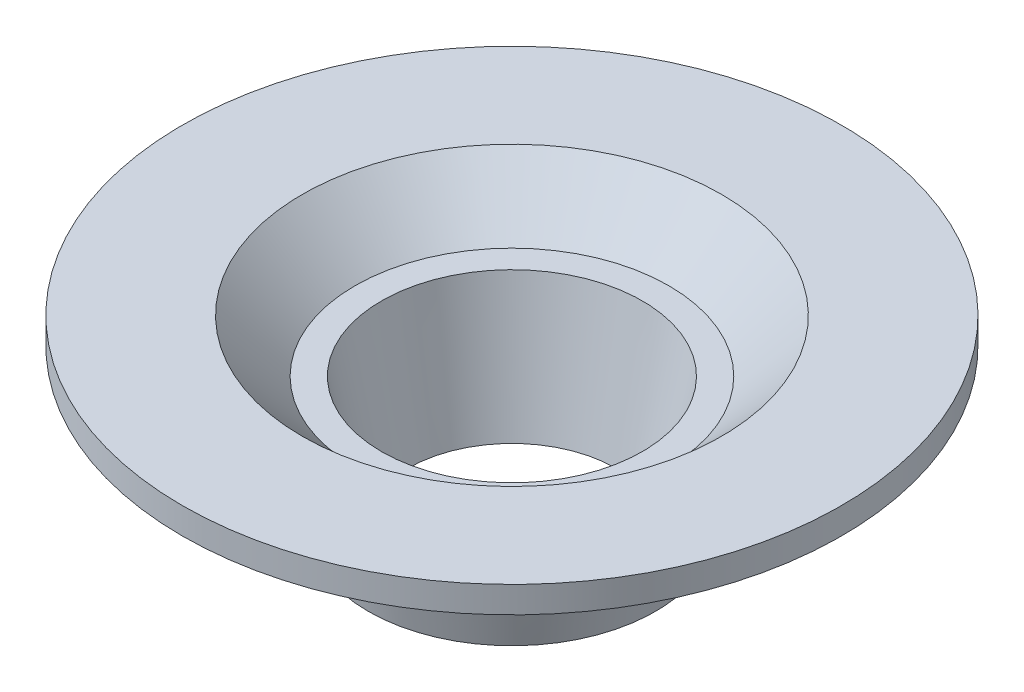
ISO-10303-21;
HEADER;
FILE_DESCRIPTION(('STEP AP214'),'2;1');
FILE_NAME('part.step','',(''),(''),'','','');
FILE_SCHEMA(('AUTOMOTIVE_DESIGN { 1 0 10303 214 1 1 1 1 }'));
ENDSEC;
DATA;
#1=APPLICATION_CONTEXT('core data for automotive mechanical design processes');
#2=APPLICATION_PROTOCOL_DEFINITION('international standard','automotive_design',2000,#1);
#3=PRODUCT_CONTEXT('',#1,'mechanical');
#4=PRODUCT('Part','Part','',(#3));
#5=PRODUCT_RELATED_PRODUCT_CATEGORY('part','',(#4));
#6=PRODUCT_DEFINITION_FORMATION('','',#4);
#7=PRODUCT_DEFINITION_CONTEXT('part definition',#1,'design');
#8=PRODUCT_DEFINITION('design','',#6,#7);
#9=PRODUCT_DEFINITION_SHAPE('','',#8);
#10=(LENGTH_UNIT() NAMED_UNIT(*) SI_UNIT(.MILLI.,.METRE.));
#11=(NAMED_UNIT(*) PLANE_ANGLE_UNIT() SI_UNIT($,.RADIAN.));
#12=(NAMED_UNIT(*) SI_UNIT($,.STERADIAN.) SOLID_ANGLE_UNIT());
#13=UNCERTAINTY_MEASURE_WITH_UNIT(LENGTH_MEASURE(1.E-05),#10,'distance_accuracy_value','');
#14=(GEOMETRIC_REPRESENTATION_CONTEXT(3) GLOBAL_UNCERTAINTY_ASSIGNED_CONTEXT((#13)) GLOBAL_UNIT_ASSIGNED_CONTEXT((#10,
#11,#12)) REPRESENTATION_CONTEXT('',''));
#15=CARTESIAN_POINT('',(0.,0.,0.));
#16=DIRECTION('',(0.,0.,1.));
#17=DIRECTION('',(1.,0.,0.));
#18=AXIS2_PLACEMENT_3D('',#15,#16,#17);
#19=CARTESIAN_POINT('',(0.,0.,0.));
#20=DIRECTION('',(0.,1.,0.));
#21=DIRECTION('',(0.,0.,1.));
#22=AXIS2_PLACEMENT_3D('',#19,#20,#21);
#23=CONICAL_SURFACE('',#22,4.95,0.197395559849881);
#24=CARTESIAN_POINT('',(0.,-5.,0.));
#25=DIRECTION('',(0.,1.,0.));
#26=DIRECTION('',(0.,0.,1.));
#27=AXIS2_PLACEMENT_3D('',#24,#25,#26);
#28=CIRCLE('',#27,3.95);
#29=CARTESIAN_POINT('',(0.,-5.,3.95));
#30=VERTEX_POINT('',#29);
#31=EDGE_CURVE('E71',#30,#30,#28,.T.);
#32=ORIENTED_EDGE('',*,*,#31,.F.);
#33=EDGE_LOOP('',(#32));
#34=FACE_BOUND('',#33,.T.);
#35=CARTESIAN_POINT('',(0.,0.,0.));
#36=DIRECTION('',(0.,1.,0.));
#37=DIRECTION('',(0.,0.,1.));
#38=AXIS2_PLACEMENT_3D('',#35,#36,#37);
#39=CIRCLE('',#38,4.95);
#40=CARTESIAN_POINT('',(0.,0.,4.95));
#41=VERTEX_POINT('',#40);
#42=EDGE_CURVE('E10',#41,#41,#39,.T.);
#43=ORIENTED_EDGE('',*,*,#42,.T.);
#44=EDGE_LOOP('',(#43));
#45=FACE_BOUND('',#44,.T.);
#46=ADVANCED_FACE('F37',(#34,#45),#23,.F.);
#47=CARTESIAN_POINT('',(4.95,0.,0.));
#48=DIRECTION('',(0.,-1.,0.));
#49=DIRECTION('',(0.,0.,-1.));
#50=AXIS2_PLACEMENT_3D('',#47,#48,#49);
#51=PLANE('',#50);
#52=ORIENTED_EDGE('',*,*,#42,.F.);
#53=EDGE_LOOP('',(#52));
#54=FACE_BOUND('',#53,.T.);
#55=CARTESIAN_POINT('',(0.,0.,0.));
#56=DIRECTION('',(0.,1.,0.));
#57=DIRECTION('',(0.,0.,1.));
#58=AXIS2_PLACEMENT_3D('',#55,#56,#57);
#59=CIRCLE('',#58,5.95);
#60=CARTESIAN_POINT('',(0.,0.,5.95));
#61=VERTEX_POINT('',#60);
#62=EDGE_CURVE('E43',#61,#61,#59,.T.);
#63=ORIENTED_EDGE('',*,*,#62,.T.);
#64=EDGE_LOOP('',(#63));
#65=FACE_BOUND('',#64,.T.);
#66=ADVANCED_FACE('F78',(#54,#65),#51,.F.);
#67=CARTESIAN_POINT('',(0.,2.,0.));
#68=DIRECTION('',(0.,1.,0.));
#69=DIRECTION('',(0.,0.,1.));
#70=AXIS2_PLACEMENT_3D('',#67,#68,#69);
#71=CONICAL_SURFACE('',#70,7.95,0.785398163397448);
#72=ORIENTED_EDGE('',*,*,#62,.F.);
#73=EDGE_LOOP('',(#72));
#74=FACE_BOUND('',#73,.T.);
#75=CARTESIAN_POINT('',(0.,2.,0.));
#76=DIRECTION('',(0.,1.,0.));
#77=DIRECTION('',(0.,0.,1.));
#78=AXIS2_PLACEMENT_3D('',#75,#76,#77);
#79=CIRCLE('',#78,7.95);
#80=CARTESIAN_POINT('',(0.,2.,7.95));
#81=VERTEX_POINT('',#80);
#82=EDGE_CURVE('E47',#81,#81,#79,.T.);
#83=ORIENTED_EDGE('',*,*,#82,.T.);
#84=EDGE_LOOP('',(#83));
#85=FACE_BOUND('',#84,.T.);
#86=ADVANCED_FACE('F82',(#74,#85),#71,.F.);
#87=CARTESIAN_POINT('',(7.95,2.,0.));
#88=DIRECTION('',(0.,-1.,0.));
#89=DIRECTION('',(0.,0.,-1.));
#90=AXIS2_PLACEMENT_3D('',#87,#88,#89);
#91=PLANE('',#90);
#92=ORIENTED_EDGE('',*,*,#82,.F.);
#93=EDGE_LOOP('',(#92));
#94=FACE_BOUND('',#93,.T.);
#95=CARTESIAN_POINT('',(0.,2.,0.));
#96=DIRECTION('',(0.,1.,0.));
#97=DIRECTION('',(0.,0.,1.));
#98=AXIS2_PLACEMENT_3D('',#95,#96,#97);
#99=CIRCLE('',#98,12.5);
#100=CARTESIAN_POINT('',(0.,2.,12.5));
#101=VERTEX_POINT('',#100);
#102=EDGE_CURVE('E51',#101,#101,#99,.T.);
#103=ORIENTED_EDGE('',*,*,#102,.T.);
#104=EDGE_LOOP('',(#103));
#105=FACE_BOUND('',#104,.T.);
#106=ADVANCED_FACE('F87',(#94,#105),#91,.F.);
#107=CARTESIAN_POINT('',(0.,0.,0.));
#108=DIRECTION('',(0.,1.,0.));
#109=DIRECTION('',(0.,0.,1.));
#110=AXIS2_PLACEMENT_3D('',#107,#108,#109);
#111=CYLINDRICAL_SURFACE('',#110,12.5);
#112=ORIENTED_EDGE('',*,*,#102,.F.);
#113=EDGE_LOOP('',(#112));
#114=FACE_BOUND('',#113,.T.);
#115=CARTESIAN_POINT('',(0.,1.,0.));
#116=DIRECTION('',(0.,1.,0.));
#117=DIRECTION('',(0.,0.,1.));
#118=AXIS2_PLACEMENT_3D('',#115,#116,#117);
#119=CIRCLE('',#118,12.5);
#120=CARTESIAN_POINT('',(0.,1.,12.5));
#121=VERTEX_POINT('',#120);
#122=EDGE_CURVE('E56',#121,#121,#119,.T.);
#123=ORIENTED_EDGE('',*,*,#122,.T.);
#124=EDGE_LOOP('',(#123));
#125=FACE_BOUND('',#124,.T.);
#126=ADVANCED_FACE('F93',(#114,#125),#111,.T.);
#127=CARTESIAN_POINT('',(10.5,1.,0.));
#128=DIRECTION('',(0.,1.,0.));
#129=DIRECTION('',(0.,0.,1.));
#130=AXIS2_PLACEMENT_3D('',#127,#128,#129);
#131=PLANE('',#130);
#132=ORIENTED_EDGE('',*,*,#122,.F.);
#133=EDGE_LOOP('',(#132));
#134=FACE_BOUND('',#133,.T.);
#135=CARTESIAN_POINT('',(0.,1.,0.));
#136=DIRECTION('',(0.,1.,0.));
#137=DIRECTION('',(0.,0.,1.));
#138=AXIS2_PLACEMENT_3D('',#135,#136,#137);
#139=CIRCLE('',#138,10.5);
#140=CARTESIAN_POINT('',(0.,1.,10.5));
#141=VERTEX_POINT('',#140);
#142=EDGE_CURVE('E59',#141,#141,#139,.T.);
#143=ORIENTED_EDGE('',*,*,#142,.T.);
#144=EDGE_LOOP('',(#143));
#145=FACE_BOUND('',#144,.T.);
#146=ADVANCED_FACE('F97',(#134,#145),#131,.F.);
#147=CARTESIAN_POINT('',(0.,-1.,0.));
#148=DIRECTION('',(0.,1.,0.));
#149=DIRECTION('',(0.,0.,1.));
#150=AXIS2_PLACEMENT_3D('',#147,#148,#149);
#151=CONICAL_SURFACE('',#150,8.5,0.785398163397448);
#152=ORIENTED_EDGE('',*,*,#142,.F.);
#153=EDGE_LOOP('',(#152));
#154=FACE_BOUND('',#153,.T.);
#155=CARTESIAN_POINT('',(0.,-1.,0.));
#156=DIRECTION('',(0.,1.,0.));
#157=DIRECTION('',(0.,0.,1.));
#158=AXIS2_PLACEMENT_3D('',#155,#156,#157);
#159=CIRCLE('',#158,8.5);
#160=CARTESIAN_POINT('',(0.,-1.,8.5));
#161=VERTEX_POINT('',#160);
#162=EDGE_CURVE('E62',#161,#161,#159,.T.);
#163=ORIENTED_EDGE('',*,*,#162,.T.);
#164=EDGE_LOOP('',(#163));
#165=FACE_BOUND('',#164,.T.);
#166=ADVANCED_FACE('F101',(#154,#165),#151,.T.);
#167=CARTESIAN_POINT('',(8.5,-1.,0.));
#168=DIRECTION('',(0.,1.,0.));
#169=DIRECTION('',(0.,0.,1.));
#170=AXIS2_PLACEMENT_3D('',#167,#168,#169);
#171=PLANE('',#170);
#172=ORIENTED_EDGE('',*,*,#162,.F.);
#173=EDGE_LOOP('',(#172));
#174=FACE_BOUND('',#173,.T.);
#175=CARTESIAN_POINT('',(0.,-1.,0.));
#176=DIRECTION('',(0.,1.,0.));
#177=DIRECTION('',(0.,0.,1.));
#178=AXIS2_PLACEMENT_3D('',#175,#176,#177);
#179=CIRCLE('',#178,6.25);
#180=CARTESIAN_POINT('',(0.,-1.,6.25));
#181=VERTEX_POINT('',#180);
#182=EDGE_CURVE('E65',#181,#181,#179,.T.);
#183=ORIENTED_EDGE('',*,*,#182,.T.);
#184=EDGE_LOOP('',(#183));
#185=FACE_BOUND('',#184,.T.);
#186=ADVANCED_FACE('F105',(#174,#185),#171,.F.);
#187=CARTESIAN_POINT('',(0.,-5.,0.));
#188=DIRECTION('',(0.,1.,0.));
#189=DIRECTION('',(0.,0.,1.));
#190=AXIS2_PLACEMENT_3D('',#187,#188,#189);
#191=CONICAL_SURFACE('',#190,5.45,0.19739555984988);
#192=ORIENTED_EDGE('',*,*,#182,.F.);
#193=EDGE_LOOP('',(#192));
#194=FACE_BOUND('',#193,.T.);
#195=CARTESIAN_POINT('',(0.,-5.,0.));
#196=DIRECTION('',(0.,1.,0.));
#197=DIRECTION('',(0.,0.,1.));
#198=AXIS2_PLACEMENT_3D('',#195,#196,#197);
#199=CIRCLE('',#198,5.45);
#200=CARTESIAN_POINT('',(0.,-5.,5.45));
#201=VERTEX_POINT('',#200);
#202=EDGE_CURVE('E68',#201,#201,#199,.T.);
#203=ORIENTED_EDGE('',*,*,#202,.T.);
#204=EDGE_LOOP('',(#203));
#205=FACE_BOUND('',#204,.T.);
#206=ADVANCED_FACE('F109',(#194,#205),#191,.T.);
#207=CARTESIAN_POINT('',(5.45,-5.,0.));
#208=DIRECTION('',(0.,1.,0.));
#209=DIRECTION('',(0.,0.,1.));
#210=AXIS2_PLACEMENT_3D('',#207,#208,#209);
#211=PLANE('',#210);
#212=ORIENTED_EDGE('',*,*,#202,.F.);
#213=EDGE_LOOP('',(#212));
#214=FACE_BOUND('',#213,.T.);
#215=ORIENTED_EDGE('',*,*,#31,.T.);
#216=EDGE_LOOP('',(#215));
#217=FACE_BOUND('',#216,.T.);
#218=ADVANCED_FACE('F75',(#214,#217),#211,.F.);
#219=CLOSED_SHELL('',(#46,#66,#86,#106,#126,#146,#166,#186,#206,#218));
#220=MANIFOLD_SOLID_BREP('B2',#219);
#221=ADVANCED_BREP_SHAPE_REPRESENTATION('',(#18,#220),#14);
#222=SHAPE_DEFINITION_REPRESENTATION(#9,#221);
ENDSEC;
END-ISO-10303-21;
